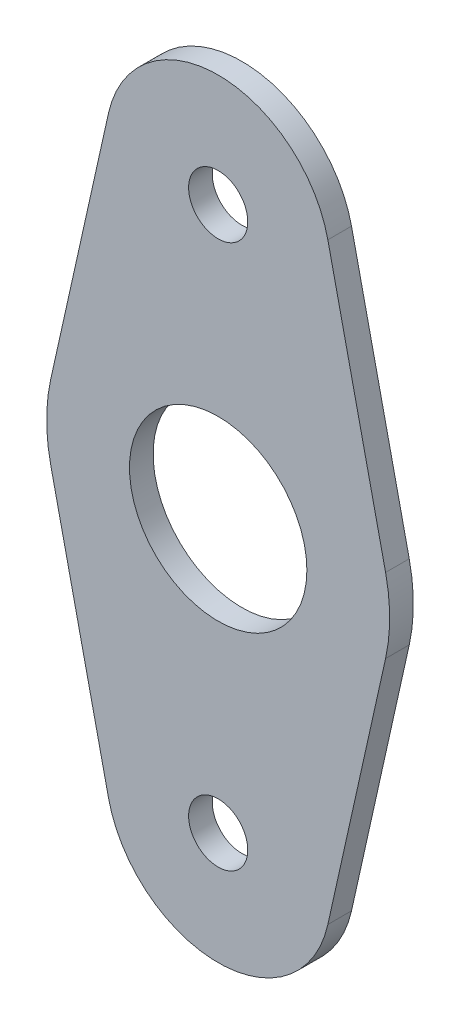
ISO-10303-21;
HEADER;
FILE_DESCRIPTION(('STEP AP214'),'2;1');
FILE_NAME('part.step','',(''),(''),'','','');
FILE_SCHEMA(('AUTOMOTIVE_DESIGN { 1 0 10303 214 1 1 1 1 }'));
ENDSEC;
DATA;
#1=APPLICATION_CONTEXT('core data for automotive mechanical design processes');
#2=APPLICATION_PROTOCOL_DEFINITION('international standard','automotive_design',2000,#1);
#3=PRODUCT_CONTEXT('',#1,'mechanical');
#4=PRODUCT('Part','Part','',(#3));
#5=PRODUCT_RELATED_PRODUCT_CATEGORY('part','',(#4));
#6=PRODUCT_DEFINITION_FORMATION('','',#4);
#7=PRODUCT_DEFINITION_CONTEXT('part definition',#1,'design');
#8=PRODUCT_DEFINITION('design','',#6,#7);
#9=PRODUCT_DEFINITION_SHAPE('','',#8);
#10=(LENGTH_UNIT() NAMED_UNIT(*) SI_UNIT(.MILLI.,.METRE.));
#11=(NAMED_UNIT(*) PLANE_ANGLE_UNIT() SI_UNIT($,.RADIAN.));
#12=(NAMED_UNIT(*) SI_UNIT($,.STERADIAN.) SOLID_ANGLE_UNIT());
#13=UNCERTAINTY_MEASURE_WITH_UNIT(LENGTH_MEASURE(1.E-05),#10,'distance_accuracy_value','');
#14=(GEOMETRIC_REPRESENTATION_CONTEXT(3) GLOBAL_UNCERTAINTY_ASSIGNED_CONTEXT((#13)) GLOBAL_UNIT_ASSIGNED_CONTEXT((#10,
#11,#12)) REPRESENTATION_CONTEXT('',''));
#15=CARTESIAN_POINT('',(0.,0.,0.));
#16=DIRECTION('',(0.,0.,1.));
#17=DIRECTION('',(1.,0.,0.));
#18=AXIS2_PLACEMENT_3D('',#15,#16,#17);
#19=CARTESIAN_POINT('',(0.,23.,1.));
#20=DIRECTION('',(0.,0.,1.));
#21=DIRECTION('',(1.,0.,0.));
#22=AXIS2_PLACEMENT_3D('',#19,#20,#21);
#23=PLANE('',#22);
#24=CARTESIAN_POINT('',(0.,23.,1.));
#25=DIRECTION('',(0.,0.,1.));
#26=DIRECTION('',(1.,0.,0.));
#27=AXIS2_PLACEMENT_3D('',#24,#25,#26);
#28=CIRCLE('',#27,2.5);
#29=CARTESIAN_POINT('',(2.5,23.,1.));
#30=VERTEX_POINT('',#29);
#31=EDGE_CURVE('E217',#30,#30,#28,.T.);
#32=ORIENTED_EDGE('',*,*,#31,.F.);
#33=EDGE_LOOP('',(#32));
#34=FACE_BOUND('',#33,.T.);
#35=CARTESIAN_POINT('',(0.,23.,1.));
#36=DIRECTION('',(0.,0.,1.));
#37=DIRECTION('',(1.,0.,0.));
#38=AXIS2_PLACEMENT_3D('',#35,#36,#37);
#39=CIRCLE('',#38,9.50000000000001);
#40=CARTESIAN_POINT('',(9.27280308896151,25.0652173913043,1.));
#41=VERTEX_POINT('',#40);
#42=CARTESIAN_POINT('',(-9.27280308896152,25.0652173913044,1.));
#43=VERTEX_POINT('',#42);
#44=EDGE_CURVE('E168',#41,#43,#39,.T.);
#45=ORIENTED_EDGE('',*,*,#44,.T.);
#46=DIRECTION('',(-0.217391304347826,-0.976084535680159,0.));
#47=VECTOR('',#46,1.);
#48=CARTESIAN_POINT('',(-9.27280308896152,25.0652173913044,1.));
#49=LINE('',#48,#47);
#50=CARTESIAN_POINT('',(-14.1532257673623,3.15217391304348,1.));
#51=VERTEX_POINT('',#50);
#52=EDGE_CURVE('E104',#43,#51,#49,.T.);
#53=ORIENTED_EDGE('',*,*,#52,.T.);
#54=CARTESIAN_POINT('',(0.,0.,1.));
#55=DIRECTION('',(0.,0.,1.));
#56=DIRECTION('',(1.,0.,0.));
#57=AXIS2_PLACEMENT_3D('',#54,#55,#56);
#58=CIRCLE('',#57,14.5);
#59=CARTESIAN_POINT('',(-14.1532257673623,-3.15217391304348,1.));
#60=VERTEX_POINT('',#59);
#61=EDGE_CURVE('E189',#51,#60,#58,.T.);
#62=ORIENTED_EDGE('',*,*,#61,.T.);
#63=DIRECTION('',(0.217391304347826,-0.976084535680159,0.));
#64=VECTOR('',#63,1.);
#65=CARTESIAN_POINT('',(-9.27280308896152,-25.0652173913044,1.));
#66=LINE('',#65,#64);
#67=CARTESIAN_POINT('',(-9.27280308896152,-25.0652173913044,1.));
#68=VERTEX_POINT('',#67);
#69=EDGE_CURVE('E203',#60,#68,#66,.T.);
#70=ORIENTED_EDGE('',*,*,#69,.T.);
#71=CARTESIAN_POINT('',(0.,-23.,1.));
#72=DIRECTION('',(0.,0.,1.));
#73=DIRECTION('',(-1.,0.,0.));
#74=AXIS2_PLACEMENT_3D('',#71,#72,#73);
#75=CIRCLE('',#74,9.50000000000001);
#76=CARTESIAN_POINT('',(9.27280308896152,-25.0652173913043,1.));
#77=VERTEX_POINT('',#76);
#78=EDGE_CURVE('E123',#68,#77,#75,.T.);
#79=ORIENTED_EDGE('',*,*,#78,.T.);
#80=DIRECTION('',(0.217391304347826,0.976084535680159,0.));
#81=VECTOR('',#80,1.);
#82=CARTESIAN_POINT('',(9.27280308896151,-25.0652173913043,1.));
#83=LINE('',#82,#81);
#84=CARTESIAN_POINT('',(14.1532257673623,-3.15217391304348,1.));
#85=VERTEX_POINT('',#84);
#86=EDGE_CURVE('E117',#77,#85,#83,.T.);
#87=ORIENTED_EDGE('',*,*,#86,.T.);
#88=CARTESIAN_POINT('',(0.,0.,1.));
#89=DIRECTION('',(0.,0.,1.));
#90=DIRECTION('',(1.,0.,0.));
#91=AXIS2_PLACEMENT_3D('',#88,#89,#90);
#92=CIRCLE('',#91,14.5);
#93=CARTESIAN_POINT('',(14.1532257673623,3.15217391304347,1.));
#94=VERTEX_POINT('',#93);
#95=EDGE_CURVE('E121',#85,#94,#92,.T.);
#96=ORIENTED_EDGE('',*,*,#95,.T.);
#97=DIRECTION('',(-0.217391304347826,0.976084535680159,0.));
#98=VECTOR('',#97,1.);
#99=CARTESIAN_POINT('',(9.27280308896151,25.0652173913043,1.));
#100=LINE('',#99,#98);
#101=EDGE_CURVE('E61',#94,#41,#100,.T.);
#102=ORIENTED_EDGE('',*,*,#101,.T.);
#103=EDGE_LOOP('',(#45,#53,#62,#70,#79,#87,#96,#102));
#104=FACE_BOUND('',#103,.T.);
#105=CARTESIAN_POINT('',(0.,0.,1.));
#106=DIRECTION('',(0.,0.,1.));
#107=DIRECTION('',(1.,0.,0.));
#108=AXIS2_PLACEMENT_3D('',#105,#106,#107);
#109=CIRCLE('',#108,7.5);
#110=CARTESIAN_POINT('',(7.5,0.,1.));
#111=VERTEX_POINT('',#110);
#112=EDGE_CURVE('E150',#111,#111,#109,.T.);
#113=ORIENTED_EDGE('',*,*,#112,.F.);
#114=EDGE_LOOP('',(#113));
#115=FACE_BOUND('',#114,.T.);
#116=CARTESIAN_POINT('',(0.,-23.,1.));
#117=DIRECTION('',(0.,0.,1.));
#118=DIRECTION('',(-1.,0.,0.));
#119=AXIS2_PLACEMENT_3D('',#116,#117,#118);
#120=CIRCLE('',#119,2.5);
#121=CARTESIAN_POINT('',(-2.5,-23.,1.));
#122=VERTEX_POINT('',#121);
#123=EDGE_CURVE('E225',#122,#122,#120,.T.);
#124=ORIENTED_EDGE('',*,*,#123,.F.);
#125=EDGE_LOOP('',(#124));
#126=FACE_BOUND('',#125,.T.);
#127=ADVANCED_FACE('F43',(#34,#104,#115,#126),#23,.T.);
#128=CARTESIAN_POINT('',(0.,23.,-1.));
#129=DIRECTION('',(0.,0.,1.));
#130=DIRECTION('',(1.,0.,0.));
#131=AXIS2_PLACEMENT_3D('',#128,#129,#130);
#132=PLANE('',#131);
#133=CARTESIAN_POINT('',(0.,23.,-1.));
#134=DIRECTION('',(0.,0.,1.));
#135=DIRECTION('',(1.,0.,0.));
#136=AXIS2_PLACEMENT_3D('',#133,#134,#135);
#137=CIRCLE('',#136,9.50000000000001);
#138=CARTESIAN_POINT('',(9.27280308896151,25.0652173913043,-1.));
#139=VERTEX_POINT('',#138);
#140=CARTESIAN_POINT('',(-9.27280308896152,25.0652173913044,-1.));
#141=VERTEX_POINT('',#140);
#142=EDGE_CURVE('E145',#139,#141,#137,.T.);
#143=ORIENTED_EDGE('',*,*,#142,.F.);
#144=DIRECTION('',(-0.217391304347826,0.976084535680159,0.));
#145=VECTOR('',#144,1.);
#146=CARTESIAN_POINT('',(9.27280308896151,25.0652173913043,-1.));
#147=LINE('',#146,#145);
#148=CARTESIAN_POINT('',(14.1532257673623,3.15217391304347,-1.));
#149=VERTEX_POINT('',#148);
#150=EDGE_CURVE('E96',#149,#139,#147,.T.);
#151=ORIENTED_EDGE('',*,*,#150,.F.);
#152=CARTESIAN_POINT('',(0.,0.,-1.));
#153=DIRECTION('',(0.,0.,1.));
#154=DIRECTION('',(1.,0.,0.));
#155=AXIS2_PLACEMENT_3D('',#152,#153,#154);
#156=CIRCLE('',#155,14.5);
#157=CARTESIAN_POINT('',(14.1532257673623,-3.15217391304348,-1.));
#158=VERTEX_POINT('',#157);
#159=EDGE_CURVE('E90',#158,#149,#156,.T.);
#160=ORIENTED_EDGE('',*,*,#159,.F.);
#161=DIRECTION('',(0.217391304347826,0.976084535680159,0.));
#162=VECTOR('',#161,1.);
#163=CARTESIAN_POINT('',(9.27280308896151,-25.0652173913043,-1.));
#164=LINE('',#163,#162);
#165=CARTESIAN_POINT('',(9.27280308896152,-25.0652173913043,-1.));
#166=VERTEX_POINT('',#165);
#167=EDGE_CURVE('E132',#166,#158,#164,.T.);
#168=ORIENTED_EDGE('',*,*,#167,.F.);
#169=CARTESIAN_POINT('',(0.,-23.,-1.));
#170=DIRECTION('',(0.,0.,1.));
#171=DIRECTION('',(-1.,0.,0.));
#172=AXIS2_PLACEMENT_3D('',#169,#170,#171);
#173=CIRCLE('',#172,9.50000000000001);
#174=CARTESIAN_POINT('',(-9.27280308896152,-25.0652173913044,-1.));
#175=VERTEX_POINT('',#174);
#176=EDGE_CURVE('E159',#175,#166,#173,.T.);
#177=ORIENTED_EDGE('',*,*,#176,.F.);
#178=DIRECTION('',(0.217391304347826,-0.976084535680159,0.));
#179=VECTOR('',#178,1.);
#180=CARTESIAN_POINT('',(-9.27280308896152,-25.0652173913044,-1.));
#181=LINE('',#180,#179);
#182=CARTESIAN_POINT('',(-14.1532257673623,-3.15217391304348,-1.));
#183=VERTEX_POINT('',#182);
#184=EDGE_CURVE('E156',#183,#175,#181,.T.);
#185=ORIENTED_EDGE('',*,*,#184,.F.);
#186=CARTESIAN_POINT('',(0.,0.,-1.));
#187=DIRECTION('',(0.,0.,1.));
#188=DIRECTION('',(1.,0.,0.));
#189=AXIS2_PLACEMENT_3D('',#186,#187,#188);
#190=CIRCLE('',#189,14.5);
#191=CARTESIAN_POINT('',(-14.1532257673623,3.15217391304348,-1.));
#192=VERTEX_POINT('',#191);
#193=EDGE_CURVE('E153',#192,#183,#190,.T.);
#194=ORIENTED_EDGE('',*,*,#193,.F.);
#195=DIRECTION('',(-0.217391304347826,-0.976084535680159,0.));
#196=VECTOR('',#195,1.);
#197=CARTESIAN_POINT('',(-9.27280308896152,25.0652173913044,-1.));
#198=LINE('',#197,#196);
#199=EDGE_CURVE('E149',#141,#192,#198,.T.);
#200=ORIENTED_EDGE('',*,*,#199,.F.);
#201=EDGE_LOOP('',(#143,#151,#160,#168,#177,#185,#194,#200));
#202=FACE_BOUND('',#201,.T.);
#203=CARTESIAN_POINT('',(0.,0.,-1.));
#204=DIRECTION('',(0.,0.,1.));
#205=DIRECTION('',(1.,0.,0.));
#206=AXIS2_PLACEMENT_3D('',#203,#204,#205);
#207=CIRCLE('',#206,7.5);
#208=CARTESIAN_POINT('',(7.5,0.,-1.));
#209=VERTEX_POINT('',#208);
#210=EDGE_CURVE('E213',#209,#209,#207,.T.);
#211=ORIENTED_EDGE('',*,*,#210,.T.);
#212=EDGE_LOOP('',(#211));
#213=FACE_BOUND('',#212,.T.);
#214=CARTESIAN_POINT('',(0.,23.,-1.));
#215=DIRECTION('',(0.,0.,1.));
#216=DIRECTION('',(1.,0.,0.));
#217=AXIS2_PLACEMENT_3D('',#214,#215,#216);
#218=CIRCLE('',#217,2.5);
#219=CARTESIAN_POINT('',(2.5,23.,-1.));
#220=VERTEX_POINT('',#219);
#221=EDGE_CURVE('E221',#220,#220,#218,.T.);
#222=ORIENTED_EDGE('',*,*,#221,.T.);
#223=EDGE_LOOP('',(#222));
#224=FACE_BOUND('',#223,.T.);
#225=CARTESIAN_POINT('',(0.,-23.,-1.));
#226=DIRECTION('',(0.,0.,1.));
#227=DIRECTION('',(-1.,0.,0.));
#228=AXIS2_PLACEMENT_3D('',#225,#226,#227);
#229=CIRCLE('',#228,2.5);
#230=CARTESIAN_POINT('',(-2.5,-23.,-1.));
#231=VERTEX_POINT('',#230);
#232=EDGE_CURVE('E229',#231,#231,#229,.T.);
#233=ORIENTED_EDGE('',*,*,#232,.T.);
#234=EDGE_LOOP('',(#233));
#235=FACE_BOUND('',#234,.T.);
#236=ADVANCED_FACE('F193',(#202,#213,#224,#235),#132,.F.);
#237=CARTESIAN_POINT('',(0.,23.,1.));
#238=DIRECTION('',(0.,0.,-1.));
#239=DIRECTION('',(-1.,0.,0.));
#240=AXIS2_PLACEMENT_3D('',#237,#238,#239);
#241=CYLINDRICAL_SURFACE('',#240,9.50000000000001);
#242=ORIENTED_EDGE('',*,*,#142,.T.);
#243=DIRECTION('',(0.,0.,-1.));
#244=VECTOR('',#243,1.);
#245=CARTESIAN_POINT('',(-9.27280308896152,25.0652173913044,1.));
#246=LINE('',#245,#244);
#247=EDGE_CURVE('E11',#43,#141,#246,.T.);
#248=ORIENTED_EDGE('',*,*,#247,.F.);
#249=ORIENTED_EDGE('',*,*,#44,.F.);
#250=DIRECTION('',(0.,0.,-1.));
#251=VECTOR('',#250,1.);
#252=CARTESIAN_POINT('',(9.27280308896151,25.0652173913043,1.));
#253=LINE('',#252,#251);
#254=EDGE_CURVE('E141',#41,#139,#253,.T.);
#255=ORIENTED_EDGE('',*,*,#254,.T.);
#256=EDGE_LOOP('',(#242,#248,#249,#255));
#257=FACE_BOUND('',#256,.T.);
#258=ADVANCED_FACE('F45',(#257),#241,.T.);
#259=CARTESIAN_POINT('',(-9.27280308896152,25.0652173913044,1.));
#260=DIRECTION('',(0.976084535680159,-0.217391304347826,0.));
#261=DIRECTION('',(0.217391304347826,0.976084535680159,0.));
#262=AXIS2_PLACEMENT_3D('',#259,#260,#261);
#263=PLANE('',#262);
#264=ORIENTED_EDGE('',*,*,#199,.T.);
#265=DIRECTION('',(0.,0.,-1.));
#266=VECTOR('',#265,1.);
#267=CARTESIAN_POINT('',(-14.1532257673623,3.15217391304348,1.));
#268=LINE('',#267,#266);
#269=EDGE_CURVE('E53',#51,#192,#268,.T.);
#270=ORIENTED_EDGE('',*,*,#269,.F.);
#271=ORIENTED_EDGE('',*,*,#52,.F.);
#272=ORIENTED_EDGE('',*,*,#247,.T.);
#273=EDGE_LOOP('',(#264,#270,#271,#272));
#274=FACE_BOUND('',#273,.T.);
#275=ADVANCED_FACE('F264',(#274),#263,.F.);
#276=CARTESIAN_POINT('',(0.,0.,1.));
#277=DIRECTION('',(0.,0.,-1.));
#278=DIRECTION('',(-1.,0.,0.));
#279=AXIS2_PLACEMENT_3D('',#276,#277,#278);
#280=CYLINDRICAL_SURFACE('',#279,14.5);
#281=ORIENTED_EDGE('',*,*,#193,.T.);
#282=DIRECTION('',(0.,0.,-1.));
#283=VECTOR('',#282,1.);
#284=CARTESIAN_POINT('',(-14.1532257673623,-3.15217391304348,1.));
#285=LINE('',#284,#283);
#286=EDGE_CURVE('E179',#60,#183,#285,.T.);
#287=ORIENTED_EDGE('',*,*,#286,.F.);
#288=ORIENTED_EDGE('',*,*,#61,.F.);
#289=ORIENTED_EDGE('',*,*,#269,.T.);
#290=EDGE_LOOP('',(#281,#287,#288,#289));
#291=FACE_BOUND('',#290,.T.);
#292=ADVANCED_FACE('F187',(#291),#280,.T.);
#293=CARTESIAN_POINT('',(-9.27280308896152,-25.0652173913044,1.));
#294=DIRECTION('',(0.976084535680159,0.217391304347826,0.));
#295=DIRECTION('',(-0.217391304347826,0.976084535680159,0.));
#296=AXIS2_PLACEMENT_3D('',#293,#294,#295);
#297=PLANE('',#296);
#298=ORIENTED_EDGE('',*,*,#184,.T.);
#299=DIRECTION('',(0.,0.,-1.));
#300=VECTOR('',#299,1.);
#301=CARTESIAN_POINT('',(-9.27280308896152,-25.0652173913044,1.));
#302=LINE('',#301,#300);
#303=EDGE_CURVE('E175',#68,#175,#302,.T.);
#304=ORIENTED_EDGE('',*,*,#303,.F.);
#305=ORIENTED_EDGE('',*,*,#69,.F.);
#306=ORIENTED_EDGE('',*,*,#286,.T.);
#307=EDGE_LOOP('',(#298,#304,#305,#306));
#308=FACE_BOUND('',#307,.T.);
#309=ADVANCED_FACE('F198',(#308),#297,.F.);
#310=CARTESIAN_POINT('',(0.,-23.,1.));
#311=DIRECTION('',(0.,0.,-1.));
#312=DIRECTION('',(-1.,0.,0.));
#313=AXIS2_PLACEMENT_3D('',#310,#311,#312);
#314=CYLINDRICAL_SURFACE('',#313,9.50000000000001);
#315=ORIENTED_EDGE('',*,*,#176,.T.);
#316=DIRECTION('',(0.,0.,-1.));
#317=VECTOR('',#316,1.);
#318=CARTESIAN_POINT('',(9.27280308896152,-25.0652173913043,1.));
#319=LINE('',#318,#317);
#320=EDGE_CURVE('E134',#77,#166,#319,.T.);
#321=ORIENTED_EDGE('',*,*,#320,.F.);
#322=ORIENTED_EDGE('',*,*,#78,.F.);
#323=ORIENTED_EDGE('',*,*,#303,.T.);
#324=EDGE_LOOP('',(#315,#321,#322,#323));
#325=FACE_BOUND('',#324,.T.);
#326=ADVANCED_FACE('F201',(#325),#314,.T.);
#327=CARTESIAN_POINT('',(9.27280308896151,-25.0652173913043,1.));
#328=DIRECTION('',(-0.976084535680159,0.217391304347826,0.));
#329=DIRECTION('',(-0.217391304347826,-0.976084535680159,0.));
#330=AXIS2_PLACEMENT_3D('',#327,#328,#329);
#331=PLANE('',#330);
#332=ORIENTED_EDGE('',*,*,#167,.T.);
#333=DIRECTION('',(0.,0.,-1.));
#334=VECTOR('',#333,1.);
#335=CARTESIAN_POINT('',(14.1532257673623,-3.15217391304348,1.));
#336=LINE('',#335,#334);
#337=EDGE_CURVE('E129',#85,#158,#336,.T.);
#338=ORIENTED_EDGE('',*,*,#337,.F.);
#339=ORIENTED_EDGE('',*,*,#86,.F.);
#340=ORIENTED_EDGE('',*,*,#320,.T.);
#341=EDGE_LOOP('',(#332,#338,#339,#340));
#342=FACE_BOUND('',#341,.T.);
#343=ADVANCED_FACE('F130',(#342),#331,.F.);
#344=CARTESIAN_POINT('',(0.,0.,1.));
#345=DIRECTION('',(0.,0.,-1.));
#346=DIRECTION('',(-1.,0.,0.));
#347=AXIS2_PLACEMENT_3D('',#344,#345,#346);
#348=CYLINDRICAL_SURFACE('',#347,14.5);
#349=ORIENTED_EDGE('',*,*,#159,.T.);
#350=DIRECTION('',(0.,0.,-1.));
#351=VECTOR('',#350,1.);
#352=CARTESIAN_POINT('',(14.1532257673623,3.15217391304347,1.));
#353=LINE('',#352,#351);
#354=EDGE_CURVE('E135',#94,#149,#353,.T.);
#355=ORIENTED_EDGE('',*,*,#354,.F.);
#356=ORIENTED_EDGE('',*,*,#95,.F.);
#357=ORIENTED_EDGE('',*,*,#337,.T.);
#358=EDGE_LOOP('',(#349,#355,#356,#357));
#359=FACE_BOUND('',#358,.T.);
#360=ADVANCED_FACE('F137',(#359),#348,.T.);
#361=CARTESIAN_POINT('',(9.27280308896151,25.0652173913043,1.));
#362=DIRECTION('',(-0.976084535680159,-0.217391304347826,0.));
#363=DIRECTION('',(0.217391304347826,-0.976084535680159,0.));
#364=AXIS2_PLACEMENT_3D('',#361,#362,#363);
#365=PLANE('',#364);
#366=ORIENTED_EDGE('',*,*,#150,.T.);
#367=ORIENTED_EDGE('',*,*,#254,.F.);
#368=ORIENTED_EDGE('',*,*,#101,.F.);
#369=ORIENTED_EDGE('',*,*,#354,.T.);
#370=EDGE_LOOP('',(#366,#367,#368,#369));
#371=FACE_BOUND('',#370,.T.);
#372=ADVANCED_FACE('F252',(#371),#365,.F.);
#373=CARTESIAN_POINT('',(0.,0.,1.));
#374=DIRECTION('',(0.,0.,-1.));
#375=DIRECTION('',(-1.,0.,0.));
#376=AXIS2_PLACEMENT_3D('',#373,#374,#375);
#377=CYLINDRICAL_SURFACE('',#376,7.5);
#378=ORIENTED_EDGE('',*,*,#112,.T.);
#379=EDGE_LOOP('',(#378));
#380=FACE_BOUND('',#379,.T.);
#381=ORIENTED_EDGE('',*,*,#210,.F.);
#382=EDGE_LOOP('',(#381));
#383=FACE_BOUND('',#382,.T.);
#384=ADVANCED_FACE('F249',(#380,#383),#377,.F.);
#385=CARTESIAN_POINT('',(0.,23.,1.));
#386=DIRECTION('',(0.,0.,-1.));
#387=DIRECTION('',(-1.,0.,0.));
#388=AXIS2_PLACEMENT_3D('',#385,#386,#387);
#389=CYLINDRICAL_SURFACE('',#388,2.5);
#390=ORIENTED_EDGE('',*,*,#31,.T.);
#391=EDGE_LOOP('',(#390));
#392=FACE_BOUND('',#391,.T.);
#393=ORIENTED_EDGE('',*,*,#221,.F.);
#394=EDGE_LOOP('',(#393));
#395=FACE_BOUND('',#394,.T.);
#396=ADVANCED_FACE('F340',(#392,#395),#389,.F.);
#397=CARTESIAN_POINT('',(0.,-23.,1.));
#398=DIRECTION('',(0.,0.,-1.));
#399=DIRECTION('',(-1.,0.,0.));
#400=AXIS2_PLACEMENT_3D('',#397,#398,#399);
#401=CYLINDRICAL_SURFACE('',#400,2.5);
#402=ORIENTED_EDGE('',*,*,#123,.T.);
#403=EDGE_LOOP('',(#402));
#404=FACE_BOUND('',#403,.T.);
#405=ORIENTED_EDGE('',*,*,#232,.F.);
#406=EDGE_LOOP('',(#405));
#407=FACE_BOUND('',#406,.T.);
#408=ADVANCED_FACE('F237',(#404,#407),#401,.F.);
#409=CLOSED_SHELL('',(#127,#236,#258,#275,#292,#309,#326,#343,#360,#372,#384,#396,#408));
#410=MANIFOLD_SOLID_BREP('B2',#409);
#411=ADVANCED_BREP_SHAPE_REPRESENTATION('',(#18,#410),#14);
#412=SHAPE_DEFINITION_REPRESENTATION(#9,#411);
ENDSEC;
END-ISO-10303-21;
